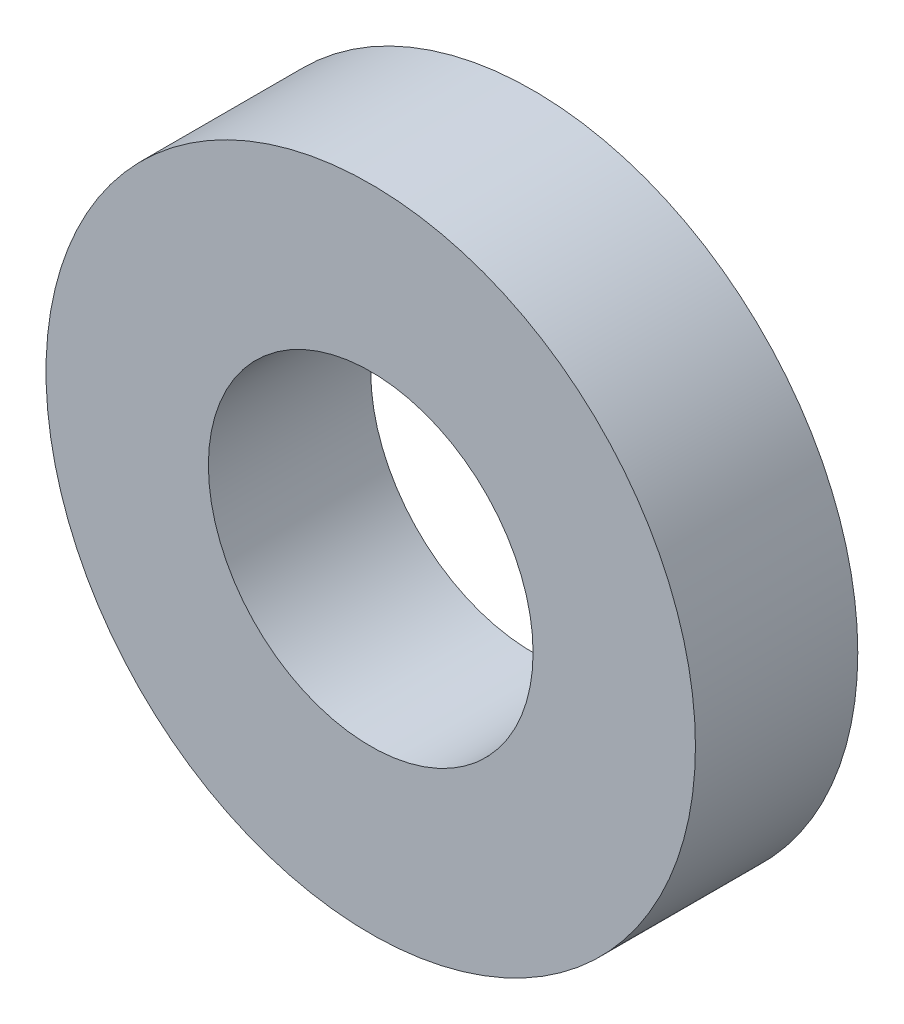
ISO-10303-21;
HEADER;
FILE_DESCRIPTION(('STEP AP214'),'2;1');
FILE_NAME('part.step','',(''),(''),'','','');
FILE_SCHEMA(('AUTOMOTIVE_DESIGN { 1 0 10303 214 1 1 1 1 }'));
ENDSEC;
DATA;
#1=APPLICATION_CONTEXT('core data for automotive mechanical design processes');
#2=APPLICATION_PROTOCOL_DEFINITION('international standard','automotive_design',2000,#1);
#3=PRODUCT_CONTEXT('',#1,'mechanical');
#4=PRODUCT('Part','Part','',(#3));
#5=PRODUCT_RELATED_PRODUCT_CATEGORY('part','',(#4));
#6=PRODUCT_DEFINITION_FORMATION('','',#4);
#7=PRODUCT_DEFINITION_CONTEXT('part definition',#1,'design');
#8=PRODUCT_DEFINITION('design','',#6,#7);
#9=PRODUCT_DEFINITION_SHAPE('','',#8);
#10=(LENGTH_UNIT() NAMED_UNIT(*) SI_UNIT(.MILLI.,.METRE.));
#11=(NAMED_UNIT(*) PLANE_ANGLE_UNIT() SI_UNIT($,.RADIAN.));
#12=(NAMED_UNIT(*) SI_UNIT($,.STERADIAN.) SOLID_ANGLE_UNIT());
#13=UNCERTAINTY_MEASURE_WITH_UNIT(LENGTH_MEASURE(1.E-05),#10,'distance_accuracy_value','');
#14=(GEOMETRIC_REPRESENTATION_CONTEXT(3) GLOBAL_UNCERTAINTY_ASSIGNED_CONTEXT((#13)) GLOBAL_UNIT_ASSIGNED_CONTEXT((#10,
#11,#12)) REPRESENTATION_CONTEXT('',''));
#15=CARTESIAN_POINT('',(0.,0.,0.));
#16=DIRECTION('',(0.,0.,1.));
#17=DIRECTION('',(1.,0.,0.));
#18=AXIS2_PLACEMENT_3D('',#15,#16,#17);
#19=CARTESIAN_POINT('',(0.,0.,15.));
#20=DIRECTION('',(0.,0.,1.));
#21=DIRECTION('',(1.,0.,0.));
#22=AXIS2_PLACEMENT_3D('',#19,#20,#21);
#23=PLANE('',#22);
#24=CARTESIAN_POINT('',(0.,0.,15.));
#25=DIRECTION('',(0.,0.,1.));
#26=DIRECTION('',(1.,0.,0.));
#27=AXIS2_PLACEMENT_3D('',#24,#25,#26);
#28=CIRCLE('',#27,30.);
#29=CARTESIAN_POINT('',(30.,0.,15.));
#30=VERTEX_POINT('',#29);
#31=EDGE_CURVE('E10',#30,#30,#28,.T.);
#32=ORIENTED_EDGE('',*,*,#31,.T.);
#33=EDGE_LOOP('',(#32));
#34=FACE_BOUND('',#33,.T.);
#35=CARTESIAN_POINT('',(0.,0.,15.));
#36=DIRECTION('',(0.,0.,1.));
#37=DIRECTION('',(1.,0.,0.));
#38=AXIS2_PLACEMENT_3D('',#35,#36,#37);
#39=CIRCLE('',#38,15.);
#40=CARTESIAN_POINT('',(15.,0.,15.));
#41=VERTEX_POINT('',#40);
#42=EDGE_CURVE('E56',#41,#41,#39,.T.);
#43=ORIENTED_EDGE('',*,*,#42,.F.);
#44=EDGE_LOOP('',(#43));
#45=FACE_BOUND('',#44,.T.);
#46=ADVANCED_FACE('F43',(#34,#45),#23,.T.);
#47=CARTESIAN_POINT('',(0.,0.,0.));
#48=DIRECTION('',(0.,0.,1.));
#49=DIRECTION('',(1.,0.,0.));
#50=AXIS2_PLACEMENT_3D('',#47,#48,#49);
#51=PLANE('',#50);
#52=CARTESIAN_POINT('',(0.,0.,0.));
#53=DIRECTION('',(0.,0.,1.));
#54=DIRECTION('',(1.,0.,0.));
#55=AXIS2_PLACEMENT_3D('',#52,#53,#54);
#56=CIRCLE('',#55,30.);
#57=CARTESIAN_POINT('',(30.,0.,0.));
#58=VERTEX_POINT('',#57);
#59=EDGE_CURVE('E47',#58,#58,#56,.T.);
#60=ORIENTED_EDGE('',*,*,#59,.F.);
#61=EDGE_LOOP('',(#60));
#62=FACE_BOUND('',#61,.T.);
#63=CARTESIAN_POINT('',(0.,0.,0.));
#64=DIRECTION('',(0.,0.,1.));
#65=DIRECTION('',(1.,0.,0.));
#66=AXIS2_PLACEMENT_3D('',#63,#64,#65);
#67=CIRCLE('',#66,15.);
#68=CARTESIAN_POINT('',(15.,0.,0.));
#69=VERTEX_POINT('',#68);
#70=EDGE_CURVE('E58',#69,#69,#67,.T.);
#71=ORIENTED_EDGE('',*,*,#70,.T.);
#72=EDGE_LOOP('',(#71));
#73=FACE_BOUND('',#72,.T.);
#74=ADVANCED_FACE('F70',(#62,#73),#51,.F.);
#75=CARTESIAN_POINT('',(0.,0.,15.));
#76=DIRECTION('',(0.,0.,-1.));
#77=DIRECTION('',(-1.,0.,0.));
#78=AXIS2_PLACEMENT_3D('',#75,#76,#77);
#79=CYLINDRICAL_SURFACE('',#78,30.);
#80=ORIENTED_EDGE('',*,*,#31,.F.);
#81=EDGE_LOOP('',(#80));
#82=FACE_BOUND('',#81,.T.);
#83=ORIENTED_EDGE('',*,*,#59,.T.);
#84=EDGE_LOOP('',(#83));
#85=FACE_BOUND('',#84,.T.);
#86=ADVANCED_FACE('F45',(#82,#85),#79,.T.);
#87=CARTESIAN_POINT('',(0.,0.,15.));
#88=DIRECTION('',(0.,0.,-1.));
#89=DIRECTION('',(-1.,0.,0.));
#90=AXIS2_PLACEMENT_3D('',#87,#88,#89);
#91=CYLINDRICAL_SURFACE('',#90,15.);
#92=ORIENTED_EDGE('',*,*,#42,.T.);
#93=EDGE_LOOP('',(#92));
#94=FACE_BOUND('',#93,.T.);
#95=ORIENTED_EDGE('',*,*,#70,.F.);
#96=EDGE_LOOP('',(#95));
#97=FACE_BOUND('',#96,.T.);
#98=ADVANCED_FACE('F66',(#94,#97),#91,.F.);
#99=CLOSED_SHELL('',(#46,#74,#86,#98));
#100=MANIFOLD_SOLID_BREP('B2',#99);
#101=ADVANCED_BREP_SHAPE_REPRESENTATION('',(#18,#100),#14);
#102=SHAPE_DEFINITION_REPRESENTATION(#9,#101);
ENDSEC;
END-ISO-10303-21;
